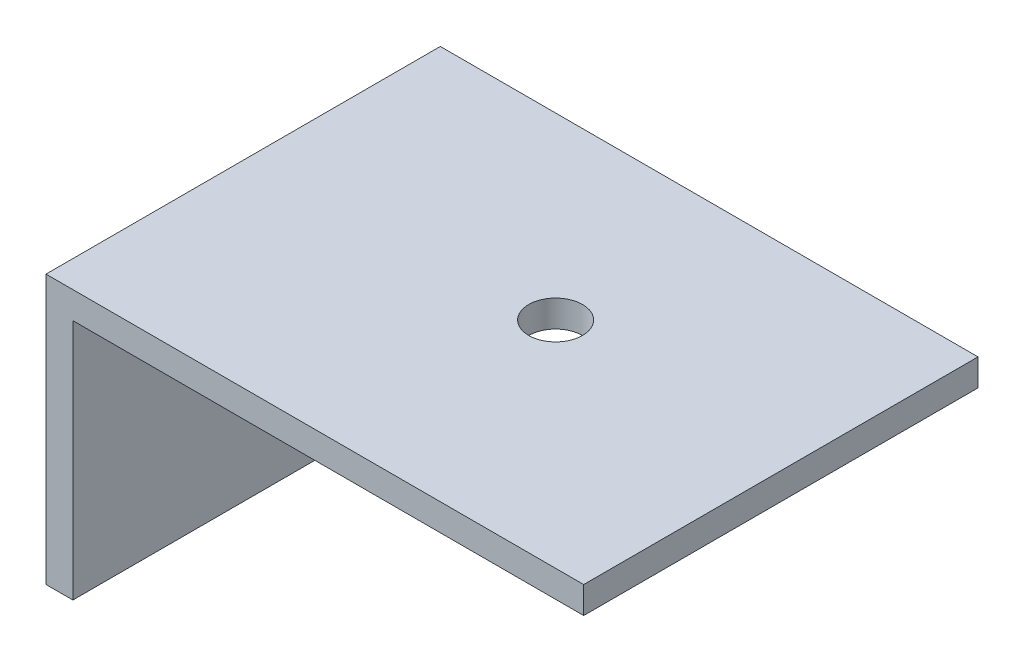
ISO-10303-21;
HEADER;
FILE_DESCRIPTION(('STEP AP214'),'2;1');
FILE_NAME('part.step','',(''),(''),'','','');
FILE_SCHEMA(('AUTOMOTIVE_DESIGN { 1 0 10303 214 1 1 1 1 }'));
ENDSEC;
DATA;
#1=APPLICATION_CONTEXT('core data for automotive mechanical design processes');
#2=APPLICATION_PROTOCOL_DEFINITION('international standard','automotive_design',2000,#1);
#3=PRODUCT_CONTEXT('',#1,'mechanical');
#4=PRODUCT('Part','Part','',(#3));
#5=PRODUCT_RELATED_PRODUCT_CATEGORY('part','',(#4));
#6=PRODUCT_DEFINITION_FORMATION('','',#4);
#7=PRODUCT_DEFINITION_CONTEXT('part definition',#1,'design');
#8=PRODUCT_DEFINITION('design','',#6,#7);
#9=PRODUCT_DEFINITION_SHAPE('','',#8);
#10=(LENGTH_UNIT() NAMED_UNIT(*) SI_UNIT(.MILLI.,.METRE.));
#11=(NAMED_UNIT(*) PLANE_ANGLE_UNIT() SI_UNIT($,.RADIAN.));
#12=(NAMED_UNIT(*) SI_UNIT($,.STERADIAN.) SOLID_ANGLE_UNIT());
#13=UNCERTAINTY_MEASURE_WITH_UNIT(LENGTH_MEASURE(1.E-05),#10,'distance_accuracy_value','');
#14=(GEOMETRIC_REPRESENTATION_CONTEXT(3) GLOBAL_UNCERTAINTY_ASSIGNED_CONTEXT((#13)) GLOBAL_UNIT_ASSIGNED_CONTEXT((#10,
#11,#12)) REPRESENTATION_CONTEXT('',''));
#15=CARTESIAN_POINT('',(0.,0.,0.));
#16=DIRECTION('',(0.,0.,1.));
#17=DIRECTION('',(1.,0.,0.));
#18=AXIS2_PLACEMENT_3D('',#15,#16,#17);
#19=CARTESIAN_POINT('',(0.,-1.5,11.));
#20=DIRECTION('',(0.,0.,1.));
#21=DIRECTION('',(1.,0.,0.));
#22=AXIS2_PLACEMENT_3D('',#19,#20,#21);
#23=PLANE('',#22);
#24=DIRECTION('',(1.,0.,0.));
#25=VECTOR('',#24,1.);
#26=CARTESIAN_POINT('',(0.,0.,11.));
#27=LINE('',#26,#25);
#28=CARTESIAN_POINT('',(-15.,0.,11.));
#29=VERTEX_POINT('',#28);
#30=CARTESIAN_POINT('',(15.,0.,11.));
#31=VERTEX_POINT('',#30);
#32=EDGE_CURVE('E120',#29,#31,#27,.T.);
#33=ORIENTED_EDGE('',*,*,#32,.F.);
#34=DIRECTION('',(0.,1.,0.));
#35=VECTOR('',#34,1.);
#36=CARTESIAN_POINT('',(-15.,-15.,11.));
#37=LINE('',#36,#35);
#38=CARTESIAN_POINT('',(-15.,-15.,11.));
#39=VERTEX_POINT('',#38);
#40=EDGE_CURVE('E143',#39,#29,#37,.T.);
#41=ORIENTED_EDGE('',*,*,#40,.F.);
#42=DIRECTION('',(1.,0.,0.));
#43=VECTOR('',#42,1.);
#44=CARTESIAN_POINT('',(0.,-15.,11.));
#45=LINE('',#44,#43);
#46=CARTESIAN_POINT('',(-13.5,-15.,11.));
#47=VERTEX_POINT('',#46);
#48=EDGE_CURVE('E166',#39,#47,#45,.T.);
#49=ORIENTED_EDGE('',*,*,#48,.T.);
#50=DIRECTION('',(0.,1.,0.));
#51=VECTOR('',#50,1.);
#52=CARTESIAN_POINT('',(-13.5,-15.,11.));
#53=LINE('',#52,#51);
#54=CARTESIAN_POINT('',(-13.5,-1.5,11.));
#55=VERTEX_POINT('',#54);
#56=EDGE_CURVE('E100',#47,#55,#53,.T.);
#57=ORIENTED_EDGE('',*,*,#56,.T.);
#58=DIRECTION('',(1.,0.,0.));
#59=VECTOR('',#58,1.);
#60=CARTESIAN_POINT('',(0.,-1.5,11.));
#61=LINE('',#60,#59);
#62=CARTESIAN_POINT('',(15.,-1.5,11.));
#63=VERTEX_POINT('',#62);
#64=EDGE_CURVE('E76',#55,#63,#61,.T.);
#65=ORIENTED_EDGE('',*,*,#64,.T.);
#66=DIRECTION('',(0.,1.,0.));
#67=VECTOR('',#66,1.);
#68=CARTESIAN_POINT('',(15.,-1.5,11.));
#69=LINE('',#68,#67);
#70=EDGE_CURVE('E44',#63,#31,#69,.T.);
#71=ORIENTED_EDGE('',*,*,#70,.T.);
#72=EDGE_LOOP('',(#33,#41,#49,#57,#65,#71));
#73=FACE_BOUND('',#72,.T.);
#74=ADVANCED_FACE('F41',(#73),#23,.T.);
#75=CARTESIAN_POINT('',(0.,-1.5,-11.));
#76=DIRECTION('',(0.,0.,1.));
#77=DIRECTION('',(1.,0.,0.));
#78=AXIS2_PLACEMENT_3D('',#75,#76,#77);
#79=PLANE('',#78);
#80=DIRECTION('',(1.,0.,0.));
#81=VECTOR('',#80,1.);
#82=CARTESIAN_POINT('',(0.,0.,-11.));
#83=LINE('',#82,#81);
#84=CARTESIAN_POINT('',(-15.,0.,-11.));
#85=VERTEX_POINT('',#84);
#86=CARTESIAN_POINT('',(15.,0.,-11.));
#87=VERTEX_POINT('',#86);
#88=EDGE_CURVE('E106',#85,#87,#83,.T.);
#89=ORIENTED_EDGE('',*,*,#88,.T.);
#90=DIRECTION('',(0.,1.,0.));
#91=VECTOR('',#90,1.);
#92=CARTESIAN_POINT('',(15.,-1.5,-11.));
#93=LINE('',#92,#91);
#94=CARTESIAN_POINT('',(15.,-1.5,-11.));
#95=VERTEX_POINT('',#94);
#96=EDGE_CURVE('E11',#95,#87,#93,.T.);
#97=ORIENTED_EDGE('',*,*,#96,.F.);
#98=DIRECTION('',(1.,0.,0.));
#99=VECTOR('',#98,1.);
#100=CARTESIAN_POINT('',(0.,-1.5,-11.));
#101=LINE('',#100,#99);
#102=CARTESIAN_POINT('',(-13.5,-1.5,-11.));
#103=VERTEX_POINT('',#102);
#104=EDGE_CURVE('E58',#103,#95,#101,.T.);
#105=ORIENTED_EDGE('',*,*,#104,.F.);
#106=DIRECTION('',(0.,1.,0.));
#107=VECTOR('',#106,1.);
#108=CARTESIAN_POINT('',(-13.5,-15.,-11.));
#109=LINE('',#108,#107);
#110=CARTESIAN_POINT('',(-13.5,-15.,-11.));
#111=VERTEX_POINT('',#110);
#112=EDGE_CURVE('E123',#111,#103,#109,.T.);
#113=ORIENTED_EDGE('',*,*,#112,.F.);
#114=DIRECTION('',(1.,0.,0.));
#115=VECTOR('',#114,1.);
#116=CARTESIAN_POINT('',(0.,-15.,-11.));
#117=LINE('',#116,#115);
#118=CARTESIAN_POINT('',(-15.,-15.,-11.));
#119=VERTEX_POINT('',#118);
#120=EDGE_CURVE('E162',#119,#111,#117,.T.);
#121=ORIENTED_EDGE('',*,*,#120,.F.);
#122=DIRECTION('',(0.,1.,0.));
#123=VECTOR('',#122,1.);
#124=CARTESIAN_POINT('',(-15.,-15.,-11.));
#125=LINE('',#124,#123);
#126=EDGE_CURVE('E109',#119,#85,#125,.T.);
#127=ORIENTED_EDGE('',*,*,#126,.T.);
#128=EDGE_LOOP('',(#89,#97,#105,#113,#121,#127));
#129=FACE_BOUND('',#128,.T.);
#130=ADVANCED_FACE('F130',(#129),#79,.F.);
#131=CARTESIAN_POINT('',(15.,-1.5,0.));
#132=DIRECTION('',(1.,0.,0.));
#133=DIRECTION('',(0.,0.,-1.));
#134=AXIS2_PLACEMENT_3D('',#131,#132,#133);
#135=PLANE('',#134);
#136=DIRECTION('',(0.,0.,-1.));
#137=VECTOR('',#136,1.);
#138=CARTESIAN_POINT('',(15.,0.,0.));
#139=LINE('',#138,#137);
#140=EDGE_CURVE('E89',#31,#87,#139,.T.);
#141=ORIENTED_EDGE('',*,*,#140,.F.);
#142=ORIENTED_EDGE('',*,*,#70,.F.);
#143=DIRECTION('',(0.,0.,-1.));
#144=VECTOR('',#143,1.);
#145=CARTESIAN_POINT('',(15.,-1.5,0.));
#146=LINE('',#145,#144);
#147=EDGE_CURVE('E87',#63,#95,#146,.T.);
#148=ORIENTED_EDGE('',*,*,#147,.T.);
#149=ORIENTED_EDGE('',*,*,#96,.T.);
#150=EDGE_LOOP('',(#141,#142,#148,#149));
#151=FACE_BOUND('',#150,.T.);
#152=ADVANCED_FACE('F86',(#151),#135,.T.);
#153=CARTESIAN_POINT('',(1.435,-1.5,-0.999999999999999));
#154=DIRECTION('',(0.,1.,0.));
#155=DIRECTION('',(0.,0.,1.));
#156=AXIS2_PLACEMENT_3D('',#153,#154,#155);
#157=CYLINDRICAL_SURFACE('',#156,1.5);
#158=CARTESIAN_POINT('',(1.435,-1.5,-0.999999999999999));
#159=DIRECTION('',(0.,1.,0.));
#160=DIRECTION('',(0.,0.,1.));
#161=AXIS2_PLACEMENT_3D('',#158,#159,#160);
#162=CIRCLE('',#161,1.5);
#163=CARTESIAN_POINT('',(1.435,-1.5,0.5));
#164=VERTEX_POINT('',#163);
#165=EDGE_CURVE('E92',#164,#164,#162,.T.);
#166=ORIENTED_EDGE('',*,*,#165,.F.);
#167=EDGE_LOOP('',(#166));
#168=FACE_BOUND('',#167,.T.);
#169=CARTESIAN_POINT('',(1.435,0.,-0.999999999999999));
#170=DIRECTION('',(0.,1.,0.));
#171=DIRECTION('',(0.,0.,1.));
#172=AXIS2_PLACEMENT_3D('',#169,#170,#171);
#173=CIRCLE('',#172,1.5);
#174=CARTESIAN_POINT('',(1.435,0.,0.5));
#175=VERTEX_POINT('',#174);
#176=EDGE_CURVE('E102',#175,#175,#173,.T.);
#177=ORIENTED_EDGE('',*,*,#176,.T.);
#178=EDGE_LOOP('',(#177));
#179=FACE_BOUND('',#178,.T.);
#180=ADVANCED_FACE('F197',(#168,#179),#157,.F.);
#181=CARTESIAN_POINT('',(0.,-1.5,0.));
#182=DIRECTION('',(0.,1.,0.));
#183=DIRECTION('',(0.,0.,1.));
#184=AXIS2_PLACEMENT_3D('',#181,#182,#183);
#185=PLANE('',#184);
#186=ORIENTED_EDGE('',*,*,#64,.F.);
#187=DIRECTION('',(0.,0.,1.));
#188=VECTOR('',#187,1.);
#189=CARTESIAN_POINT('',(-13.5,-1.5,0.));
#190=LINE('',#189,#188);
#191=EDGE_CURVE('E114',#103,#55,#190,.T.);
#192=ORIENTED_EDGE('',*,*,#191,.F.);
#193=ORIENTED_EDGE('',*,*,#104,.T.);
#194=ORIENTED_EDGE('',*,*,#147,.F.);
#195=EDGE_LOOP('',(#186,#192,#193,#194));
#196=FACE_BOUND('',#195,.T.);
#197=ORIENTED_EDGE('',*,*,#165,.T.);
#198=EDGE_LOOP('',(#197));
#199=FACE_BOUND('',#198,.T.);
#200=ADVANCED_FACE('F93',(#196,#199),#185,.F.);
#201=CARTESIAN_POINT('',(0.,0.,0.));
#202=DIRECTION('',(0.,1.,0.));
#203=DIRECTION('',(0.,0.,1.));
#204=AXIS2_PLACEMENT_3D('',#201,#202,#203);
#205=PLANE('',#204);
#206=ORIENTED_EDGE('',*,*,#32,.T.);
#207=ORIENTED_EDGE('',*,*,#140,.T.);
#208=ORIENTED_EDGE('',*,*,#88,.F.);
#209=DIRECTION('',(0.,0.,-1.));
#210=VECTOR('',#209,1.);
#211=CARTESIAN_POINT('',(-15.,0.,0.));
#212=LINE('',#211,#210);
#213=EDGE_CURVE('E139',#29,#85,#212,.T.);
#214=ORIENTED_EDGE('',*,*,#213,.F.);
#215=EDGE_LOOP('',(#206,#207,#208,#214));
#216=FACE_BOUND('',#215,.T.);
#217=ORIENTED_EDGE('',*,*,#176,.F.);
#218=EDGE_LOOP('',(#217));
#219=FACE_BOUND('',#218,.T.);
#220=ADVANCED_FACE('F137',(#216,#219),#205,.T.);
#221=CARTESIAN_POINT('',(-13.5,-15.,0.));
#222=DIRECTION('',(-1.,0.,0.));
#223=DIRECTION('',(0.,0.,1.));
#224=AXIS2_PLACEMENT_3D('',#221,#222,#223);
#225=PLANE('',#224);
#226=ORIENTED_EDGE('',*,*,#112,.T.);
#227=ORIENTED_EDGE('',*,*,#191,.T.);
#228=ORIENTED_EDGE('',*,*,#56,.F.);
#229=DIRECTION('',(0.,0.,1.));
#230=VECTOR('',#229,1.);
#231=CARTESIAN_POINT('',(-13.5,-15.,0.));
#232=LINE('',#231,#230);
#233=EDGE_CURVE('E155',#111,#47,#232,.T.);
#234=ORIENTED_EDGE('',*,*,#233,.F.);
#235=EDGE_LOOP('',(#226,#227,#228,#234));
#236=FACE_BOUND('',#235,.T.);
#237=ADVANCED_FACE('F176',(#236),#225,.F.);
#238=CARTESIAN_POINT('',(-15.,-15.,0.));
#239=DIRECTION('',(1.,0.,0.));
#240=DIRECTION('',(0.,0.,-1.));
#241=AXIS2_PLACEMENT_3D('',#238,#239,#240);
#242=PLANE('',#241);
#243=ORIENTED_EDGE('',*,*,#213,.T.);
#244=ORIENTED_EDGE('',*,*,#126,.F.);
#245=DIRECTION('',(0.,0.,-1.));
#246=VECTOR('',#245,1.);
#247=CARTESIAN_POINT('',(-15.,-15.,0.));
#248=LINE('',#247,#246);
#249=EDGE_CURVE('E149',#39,#119,#248,.T.);
#250=ORIENTED_EDGE('',*,*,#249,.F.);
#251=ORIENTED_EDGE('',*,*,#40,.T.);
#252=EDGE_LOOP('',(#243,#244,#250,#251));
#253=FACE_BOUND('',#252,.T.);
#254=ADVANCED_FACE('F147',(#253),#242,.F.);
#255=CARTESIAN_POINT('',(0.,-15.,0.));
#256=DIRECTION('',(0.,1.,0.));
#257=DIRECTION('',(0.,0.,1.));
#258=AXIS2_PLACEMENT_3D('',#255,#256,#257);
#259=PLANE('',#258);
#260=ORIENTED_EDGE('',*,*,#120,.T.);
#261=ORIENTED_EDGE('',*,*,#233,.T.);
#262=ORIENTED_EDGE('',*,*,#48,.F.);
#263=ORIENTED_EDGE('',*,*,#249,.T.);
#264=EDGE_LOOP('',(#260,#261,#262,#263));
#265=FACE_BOUND('',#264,.T.);
#266=ADVANCED_FACE('F174',(#265),#259,.F.);
#267=CLOSED_SHELL('',(#74,#130,#152,#180,#200,#220,#237,#254,#266));
#268=MANIFOLD_SOLID_BREP('B2',#267);
#269=ADVANCED_BREP_SHAPE_REPRESENTATION('',(#18,#268),#14);
#270=SHAPE_DEFINITION_REPRESENTATION(#9,#269);
ENDSEC;
END-ISO-10303-21;
